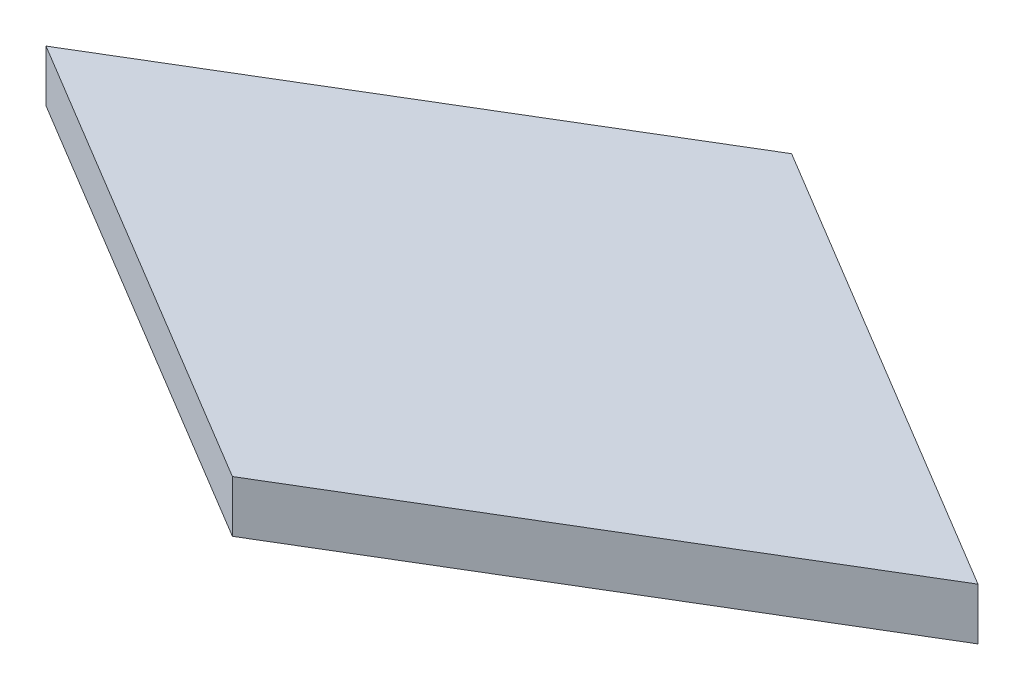
ISO-10303-21;
HEADER;
FILE_DESCRIPTION(('STEP AP214'),'2;1');
FILE_NAME('part.step','',(''),(''),'','','');
FILE_SCHEMA(('AUTOMOTIVE_DESIGN { 1 0 10303 214 1 1 1 1 }'));
ENDSEC;
DATA;
#1=APPLICATION_CONTEXT('core data for automotive mechanical design processes');
#2=APPLICATION_PROTOCOL_DEFINITION('international standard','automotive_design',2000,#1);
#3=PRODUCT_CONTEXT('',#1,'mechanical');
#4=PRODUCT('Part','Part','',(#3));
#5=PRODUCT_RELATED_PRODUCT_CATEGORY('part','',(#4));
#6=PRODUCT_DEFINITION_FORMATION('','',#4);
#7=PRODUCT_DEFINITION_CONTEXT('part definition',#1,'design');
#8=PRODUCT_DEFINITION('design','',#6,#7);
#9=PRODUCT_DEFINITION_SHAPE('','',#8);
#10=(LENGTH_UNIT() NAMED_UNIT(*) SI_UNIT(.MILLI.,.METRE.));
#11=(NAMED_UNIT(*) PLANE_ANGLE_UNIT() SI_UNIT($,.RADIAN.));
#12=(NAMED_UNIT(*) SI_UNIT($,.STERADIAN.) SOLID_ANGLE_UNIT());
#13=UNCERTAINTY_MEASURE_WITH_UNIT(LENGTH_MEASURE(1.E-05),#10,'distance_accuracy_value','');
#14=(GEOMETRIC_REPRESENTATION_CONTEXT(3) GLOBAL_UNCERTAINTY_ASSIGNED_CONTEXT((#13)) GLOBAL_UNIT_ASSIGNED_CONTEXT((#10,
#11,#12)) REPRESENTATION_CONTEXT('',''));
#15=CARTESIAN_POINT('',(0.,0.,0.));
#16=DIRECTION('',(0.,0.,1.));
#17=DIRECTION('',(1.,0.,0.));
#18=AXIS2_PLACEMENT_3D('',#15,#16,#17);
#19=CARTESIAN_POINT('',(-45.,5.,0.));
#20=DIRECTION('',(0.514495755427526,0.,0.857492925712544));
#21=DIRECTION('',(0.857492925712544,0.,-0.514495755427527));
#22=AXIS2_PLACEMENT_3D('',#19,#20,#21);
#23=PLANE('',#22);
#24=DIRECTION('',(-0.857492925712544,0.,0.514495755427527));
#25=VECTOR('',#24,1.);
#26=CARTESIAN_POINT('',(-45.,0.,0.));
#27=LINE('',#26,#25);
#28=CARTESIAN_POINT('',(0.,0.,-27.));
#29=VERTEX_POINT('',#28);
#30=CARTESIAN_POINT('',(-45.,0.,0.));
#31=VERTEX_POINT('',#30);
#32=EDGE_CURVE('E102',#29,#31,#27,.T.);
#33=ORIENTED_EDGE('',*,*,#32,.T.);
#34=DIRECTION('',(0.,-1.,0.));
#35=VECTOR('',#34,1.);
#36=CARTESIAN_POINT('',(-45.,5.,0.));
#37=LINE('',#36,#35);
#38=CARTESIAN_POINT('',(-45.,5.,0.));
#39=VERTEX_POINT('',#38);
#40=EDGE_CURVE('E11',#39,#31,#37,.T.);
#41=ORIENTED_EDGE('',*,*,#40,.F.);
#42=DIRECTION('',(-0.857492925712544,0.,0.514495755427527));
#43=VECTOR('',#42,1.);
#44=CARTESIAN_POINT('',(-45.,5.,0.));
#45=LINE('',#44,#43);
#46=CARTESIAN_POINT('',(0.,5.,-27.));
#47=VERTEX_POINT('',#46);
#48=EDGE_CURVE('E90',#47,#39,#45,.T.);
#49=ORIENTED_EDGE('',*,*,#48,.F.);
#50=DIRECTION('',(0.,-1.,0.));
#51=VECTOR('',#50,1.);
#52=CARTESIAN_POINT('',(0.,5.,-27.));
#53=LINE('',#52,#51);
#54=EDGE_CURVE('E98',#47,#29,#53,.T.);
#55=ORIENTED_EDGE('',*,*,#54,.T.);
#56=EDGE_LOOP('',(#33,#41,#49,#55));
#57=FACE_BOUND('',#56,.T.);
#58=ADVANCED_FACE('F39',(#57),#23,.F.);
#59=CARTESIAN_POINT('',(-45.,5.,0.));
#60=DIRECTION('',(0.514495755427526,0.,-0.857492925712544));
#61=DIRECTION('',(-0.857492925712544,0.,-0.514495755427527));
#62=AXIS2_PLACEMENT_3D('',#59,#60,#61);
#63=PLANE('',#62);
#64=DIRECTION('',(0.857492925712544,0.,0.514495755427527));
#65=VECTOR('',#64,1.);
#66=CARTESIAN_POINT('',(-45.,0.,0.));
#67=LINE('',#66,#65);
#68=CARTESIAN_POINT('',(0.,0.,27.));
#69=VERTEX_POINT('',#68);
#70=EDGE_CURVE('E94',#31,#69,#67,.T.);
#71=ORIENTED_EDGE('',*,*,#70,.T.);
#72=DIRECTION('',(0.,-1.,0.));
#73=VECTOR('',#72,1.);
#74=CARTESIAN_POINT('',(0.,5.,27.));
#75=LINE('',#74,#73);
#76=CARTESIAN_POINT('',(0.,5.,27.));
#77=VERTEX_POINT('',#76);
#78=EDGE_CURVE('E47',#77,#69,#75,.T.);
#79=ORIENTED_EDGE('',*,*,#78,.F.);
#80=DIRECTION('',(0.857492925712544,0.,0.514495755427527));
#81=VECTOR('',#80,1.);
#82=CARTESIAN_POINT('',(-45.,5.,0.));
#83=LINE('',#82,#81);
#84=EDGE_CURVE('E85',#39,#77,#83,.T.);
#85=ORIENTED_EDGE('',*,*,#84,.F.);
#86=ORIENTED_EDGE('',*,*,#40,.T.);
#87=EDGE_LOOP('',(#71,#79,#85,#86));
#88=FACE_BOUND('',#87,.T.);
#89=ADVANCED_FACE('F93',(#88),#63,.F.);
#90=CARTESIAN_POINT('',(45.,5.,0.));
#91=DIRECTION('',(-0.514495755427526,0.,-0.857492925712544));
#92=DIRECTION('',(-0.857492925712544,0.,0.514495755427527));
#93=AXIS2_PLACEMENT_3D('',#90,#91,#92);
#94=PLANE('',#93);
#95=DIRECTION('',(0.857492925712544,0.,-0.514495755427527));
#96=VECTOR('',#95,1.);
#97=CARTESIAN_POINT('',(45.,0.,0.));
#98=LINE('',#97,#96);
#99=CARTESIAN_POINT('',(45.,0.,0.));
#100=VERTEX_POINT('',#99);
#101=EDGE_CURVE('E72',#69,#100,#98,.T.);
#102=ORIENTED_EDGE('',*,*,#101,.T.);
#103=DIRECTION('',(0.,-1.,0.));
#104=VECTOR('',#103,1.);
#105=CARTESIAN_POINT('',(45.,5.,0.));
#106=LINE('',#105,#104);
#107=CARTESIAN_POINT('',(45.,5.,0.));
#108=VERTEX_POINT('',#107);
#109=EDGE_CURVE('E95',#108,#100,#106,.T.);
#110=ORIENTED_EDGE('',*,*,#109,.F.);
#111=DIRECTION('',(0.857492925712544,0.,-0.514495755427527));
#112=VECTOR('',#111,1.);
#113=CARTESIAN_POINT('',(45.,5.,0.));
#114=LINE('',#113,#112);
#115=EDGE_CURVE('E88',#77,#108,#114,.T.);
#116=ORIENTED_EDGE('',*,*,#115,.F.);
#117=ORIENTED_EDGE('',*,*,#78,.T.);
#118=EDGE_LOOP('',(#102,#110,#116,#117));
#119=FACE_BOUND('',#118,.T.);
#120=ADVANCED_FACE('F96',(#119),#94,.F.);
#121=CARTESIAN_POINT('',(45.,5.,0.));
#122=DIRECTION('',(-0.514495755427526,0.,0.857492925712544));
#123=DIRECTION('',(0.857492925712544,0.,0.514495755427527));
#124=AXIS2_PLACEMENT_3D('',#121,#122,#123);
#125=PLANE('',#124);
#126=DIRECTION('',(-0.857492925712544,0.,-0.514495755427527));
#127=VECTOR('',#126,1.);
#128=CARTESIAN_POINT('',(45.,0.,0.));
#129=LINE('',#128,#127);
#130=EDGE_CURVE('E78',#100,#29,#129,.T.);
#131=ORIENTED_EDGE('',*,*,#130,.T.);
#132=ORIENTED_EDGE('',*,*,#54,.F.);
#133=DIRECTION('',(-0.857492925712544,0.,-0.514495755427527));
#134=VECTOR('',#133,1.);
#135=CARTESIAN_POINT('',(45.,5.,0.));
#136=LINE('',#135,#134);
#137=EDGE_CURVE('E55',#108,#47,#136,.T.);
#138=ORIENTED_EDGE('',*,*,#137,.F.);
#139=ORIENTED_EDGE('',*,*,#109,.T.);
#140=EDGE_LOOP('',(#131,#132,#138,#139));
#141=FACE_BOUND('',#140,.T.);
#142=ADVANCED_FACE('F109',(#141),#125,.F.);
#143=CARTESIAN_POINT('',(0.,5.,0.));
#144=DIRECTION('',(0.,1.,0.));
#145=DIRECTION('',(0.,0.,1.));
#146=AXIS2_PLACEMENT_3D('',#143,#144,#145);
#147=PLANE('',#146);
#148=ORIENTED_EDGE('',*,*,#48,.T.);
#149=ORIENTED_EDGE('',*,*,#84,.T.);
#150=ORIENTED_EDGE('',*,*,#115,.T.);
#151=ORIENTED_EDGE('',*,*,#137,.T.);
#152=EDGE_LOOP('',(#148,#149,#150,#151));
#153=FACE_BOUND('',#152,.T.);
#154=ADVANCED_FACE('F86',(#153),#147,.T.);
#155=CARTESIAN_POINT('',(0.,0.,0.));
#156=DIRECTION('',(0.,1.,0.));
#157=DIRECTION('',(0.,0.,1.));
#158=AXIS2_PLACEMENT_3D('',#155,#156,#157);
#159=PLANE('',#158);
#160=ORIENTED_EDGE('',*,*,#32,.F.);
#161=ORIENTED_EDGE('',*,*,#130,.F.);
#162=ORIENTED_EDGE('',*,*,#101,.F.);
#163=ORIENTED_EDGE('',*,*,#70,.F.);
#164=EDGE_LOOP('',(#160,#161,#162,#163));
#165=FACE_BOUND('',#164,.T.);
#166=ADVANCED_FACE('F112',(#165),#159,.F.);
#167=CLOSED_SHELL('',(#58,#89,#120,#142,#154,#166));
#168=MANIFOLD_SOLID_BREP('B2',#167);
#169=ADVANCED_BREP_SHAPE_REPRESENTATION('',(#18,#168),#14);
#170=SHAPE_DEFINITION_REPRESENTATION(#9,#169);
ENDSEC;
END-ISO-10303-21;
